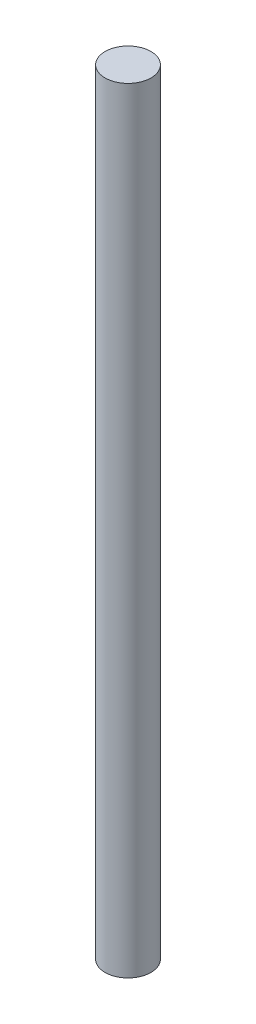
ISO-10303-21;
HEADER;
FILE_DESCRIPTION(('STEP AP214'),'2;1');
FILE_NAME('part.step','',(''),(''),'','','');
FILE_SCHEMA(('AUTOMOTIVE_DESIGN { 1 0 10303 214 1 1 1 1 }'));
ENDSEC;
DATA;
#1=APPLICATION_CONTEXT('core data for automotive mechanical design processes');
#2=APPLICATION_PROTOCOL_DEFINITION('international standard','automotive_design',2000,#1);
#3=PRODUCT_CONTEXT('',#1,'mechanical');
#4=PRODUCT('Part','Part','',(#3));
#5=PRODUCT_RELATED_PRODUCT_CATEGORY('part','',(#4));
#6=PRODUCT_DEFINITION_FORMATION('','',#4);
#7=PRODUCT_DEFINITION_CONTEXT('part definition',#1,'design');
#8=PRODUCT_DEFINITION('design','',#6,#7);
#9=PRODUCT_DEFINITION_SHAPE('','',#8);
#10=(LENGTH_UNIT() NAMED_UNIT(*) SI_UNIT(.MILLI.,.METRE.));
#11=(NAMED_UNIT(*) PLANE_ANGLE_UNIT() SI_UNIT($,.RADIAN.));
#12=(NAMED_UNIT(*) SI_UNIT($,.STERADIAN.) SOLID_ANGLE_UNIT());
#13=UNCERTAINTY_MEASURE_WITH_UNIT(LENGTH_MEASURE(1.E-05),#10,'distance_accuracy_value','');
#14=(GEOMETRIC_REPRESENTATION_CONTEXT(3) GLOBAL_UNCERTAINTY_ASSIGNED_CONTEXT((#13)) GLOBAL_UNIT_ASSIGNED_CONTEXT((#10,
#11,#12)) REPRESENTATION_CONTEXT('',''));
#15=CARTESIAN_POINT('',(0.,0.,0.));
#16=DIRECTION('',(0.,0.,1.));
#17=DIRECTION('',(1.,0.,0.));
#18=AXIS2_PLACEMENT_3D('',#15,#16,#17);
#19=CARTESIAN_POINT('',(0.,54.,0.));
#20=DIRECTION('',(0.,-1.,0.));
#21=DIRECTION('',(0.,0.,-1.));
#22=AXIS2_PLACEMENT_3D('',#19,#20,#21);
#23=CYLINDRICAL_SURFACE('',#22,3.);
#24=CARTESIAN_POINT('',(0.,95.2937140592282,0.));
#25=DIRECTION('',(0.,1.,0.));
#26=DIRECTION('',(0.,0.,1.));
#27=AXIS2_PLACEMENT_3D('',#24,#25,#26);
#28=CIRCLE('',#27,3.);
#29=CARTESIAN_POINT('',(0.,95.2937140592282,3.));
#30=VERTEX_POINT('',#29);
#31=EDGE_CURVE('E10',#30,#30,#28,.T.);
#32=ORIENTED_EDGE('',*,*,#31,.F.);
#33=EDGE_LOOP('',(#32));
#34=FACE_BOUND('',#33,.T.);
#35=CARTESIAN_POINT('',(0.,-6.,0.));
#36=DIRECTION('',(0.,-1.,0.));
#37=DIRECTION('',(0.,0.,-1.));
#38=AXIS2_PLACEMENT_3D('',#35,#36,#37);
#39=CIRCLE('',#38,3.);
#40=CARTESIAN_POINT('',(0.,-6.,-3.));
#41=VERTEX_POINT('',#40);
#42=EDGE_CURVE('E40',#41,#41,#39,.T.);
#43=ORIENTED_EDGE('',*,*,#42,.F.);
#44=EDGE_LOOP('',(#43));
#45=FACE_BOUND('',#44,.T.);
#46=ADVANCED_FACE('F34',(#34,#45),#23,.T.);
#47=CARTESIAN_POINT('',(0.,95.2937140592282,0.));
#48=DIRECTION('',(0.,1.,0.));
#49=DIRECTION('',(0.,0.,1.));
#50=AXIS2_PLACEMENT_3D('',#47,#48,#49);
#51=PLANE('',#50);
#52=ORIENTED_EDGE('',*,*,#31,.T.);
#53=EDGE_LOOP('',(#52));
#54=FACE_BOUND('',#53,.T.);
#55=ADVANCED_FACE('F49',(#54),#51,.T.);
#56=CARTESIAN_POINT('',(0.,-6.,0.));
#57=DIRECTION('',(0.,-1.,0.));
#58=DIRECTION('',(0.,0.,-1.));
#59=AXIS2_PLACEMENT_3D('',#56,#57,#58);
#60=PLANE('',#59);
#61=ORIENTED_EDGE('',*,*,#42,.T.);
#62=EDGE_LOOP('',(#61));
#63=FACE_BOUND('',#62,.T.);
#64=ADVANCED_FACE('F46',(#63),#60,.T.);
#65=CLOSED_SHELL('',(#46,#55,#64));
#66=MANIFOLD_SOLID_BREP('B2',#65);
#67=ADVANCED_BREP_SHAPE_REPRESENTATION('',(#18,#66),#14);
#68=SHAPE_DEFINITION_REPRESENTATION(#9,#67);
ENDSEC;
END-ISO-10303-21;
